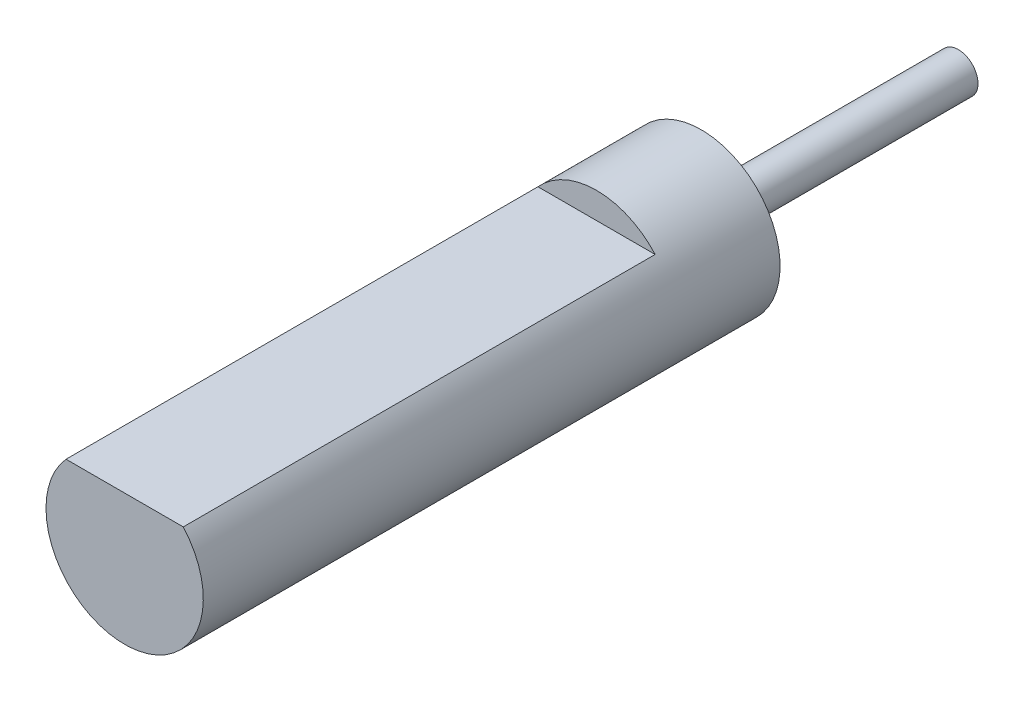
ISO-10303-21;
HEADER;
FILE_DESCRIPTION(('STEP AP214'),'2;1');
FILE_NAME('part.step','',(''),(''),'','','');
FILE_SCHEMA(('AUTOMOTIVE_DESIGN { 1 0 10303 214 1 1 1 1 }'));
ENDSEC;
DATA;
#1=APPLICATION_CONTEXT('core data for automotive mechanical design processes');
#2=APPLICATION_PROTOCOL_DEFINITION('international standard','automotive_design',2000,#1);
#3=PRODUCT_CONTEXT('',#1,'mechanical');
#4=PRODUCT('Part','Part','',(#3));
#5=PRODUCT_RELATED_PRODUCT_CATEGORY('part','',(#4));
#6=PRODUCT_DEFINITION_FORMATION('','',#4);
#7=PRODUCT_DEFINITION_CONTEXT('part definition',#1,'design');
#8=PRODUCT_DEFINITION('design','',#6,#7);
#9=PRODUCT_DEFINITION_SHAPE('','',#8);
#10=(LENGTH_UNIT() NAMED_UNIT(*) SI_UNIT(.MILLI.,.METRE.));
#11=(NAMED_UNIT(*) PLANE_ANGLE_UNIT() SI_UNIT($,.RADIAN.));
#12=(NAMED_UNIT(*) SI_UNIT($,.STERADIAN.) SOLID_ANGLE_UNIT());
#13=UNCERTAINTY_MEASURE_WITH_UNIT(LENGTH_MEASURE(1.E-05),#10,'distance_accuracy_value','');
#14=(GEOMETRIC_REPRESENTATION_CONTEXT(3) GLOBAL_UNCERTAINTY_ASSIGNED_CONTEXT((#13)) GLOBAL_UNIT_ASSIGNED_CONTEXT((#10,
#11,#12)) REPRESENTATION_CONTEXT('',''));
#15=CARTESIAN_POINT('',(0.,0.,0.));
#16=DIRECTION('',(0.,0.,1.));
#17=DIRECTION('',(1.,0.,0.));
#18=AXIS2_PLACEMENT_3D('',#15,#16,#17);
#19=CARTESIAN_POINT('',(1.83444122615383E-13,-1.99893213465373E-13,-5.7));
#20=DIRECTION('',(0.,0.,-1.));
#21=DIRECTION('',(0.,-1.,0.));
#22=AXIS2_PLACEMENT_3D('',#19,#20,#21);
#23=PLANE('',#22);
#24=CARTESIAN_POINT('',(1.83444122615383E-13,-1.99893213465373E-13,-5.7));
#25=DIRECTION('',(0.,0.,-1.));
#26=DIRECTION('',(-1.,0.,0.));
#27=AXIS2_PLACEMENT_3D('',#24,#25,#26);
#28=CIRCLE('',#27,0.375);
#29=CARTESIAN_POINT('',(0.375000000000184,-1.99985061975309E-13,-5.7));
#30=VERTEX_POINT('',#29);
#31=EDGE_CURVE('E11',#30,#30,#28,.T.);
#32=ORIENTED_EDGE('',*,*,#31,.T.);
#33=EDGE_LOOP('',(#32));
#34=FACE_BOUND('',#33,.T.);
#35=ADVANCED_FACE('F17',(#34),#23,.T.);
#36=CARTESIAN_POINT('',(1.83444122615383E-13,-1.99460272726942E-13,-2.3));
#37=DIRECTION('',(0.,0.,1.));
#38=DIRECTION('',(-1.,0.,0.));
#39=AXIS2_PLACEMENT_3D('',#36,#37,#38);
#40=CYLINDRICAL_SURFACE('',#39,0.375);
#41=CARTESIAN_POINT('',(1.83444122615383E-13,-1.99269269459987E-13,-0.8));
#42=DIRECTION('',(0.,0.,-1.));
#43=DIRECTION('',(-1.,0.,0.));
#44=AXIS2_PLACEMENT_3D('',#41,#42,#43);
#45=CIRCLE('',#44,0.375);
#46=CARTESIAN_POINT('',(0.375000000000184,-1.99269269459987E-13,-0.8));
#47=VERTEX_POINT('',#46);
#48=EDGE_CURVE('E76',#47,#47,#45,.T.);
#49=ORIENTED_EDGE('',*,*,#48,.T.);
#50=DIRECTION('',(0.,0.,-1.));
#51=VECTOR('',#50,1.);
#52=CARTESIAN_POINT('',(0.375000000000184,-1.99460272726942E-13,-2.3));
#53=LINE('',#52,#51);
#54=EDGE_CURVE('E20',#47,#30,#53,.T.);
#55=ORIENTED_EDGE('',*,*,#54,.T.);
#56=ORIENTED_EDGE('',*,*,#31,.F.);
#57=ORIENTED_EDGE('',*,*,#54,.F.);
#58=EDGE_LOOP('',(#49,#55,#56,#57));
#59=FACE_BOUND('',#58,.T.);
#60=ADVANCED_FACE('F106',(#59),#40,.T.);
#61=CARTESIAN_POINT('',(1.83444122615383E-13,-1.99014598437381E-13,1.2));
#62=DIRECTION('',(0.,0.,1.));
#63=DIRECTION('',(0.,-1.,0.));
#64=AXIS2_PLACEMENT_3D('',#61,#62,#63);
#65=PLANE('',#64);
#66=CARTESIAN_POINT('',(1.83444122615383E-13,-1.99014598437381E-13,1.2));
#67=DIRECTION('',(0.,0.,1.));
#68=DIRECTION('',(-1.,0.,0.));
#69=AXIS2_PLACEMENT_3D('',#66,#67,#68);
#70=CIRCLE('',#69,1.5);
#71=CARTESIAN_POINT('',(1.11803398876017,0.999999999996331,1.2));
#72=VERTEX_POINT('',#71);
#73=CARTESIAN_POINT('',(-1.1180339887598,0.999999999996331,1.2));
#74=VERTEX_POINT('',#73);
#75=EDGE_CURVE('E88',#72,#74,#70,.T.);
#76=ORIENTED_EDGE('',*,*,#75,.T.);
#77=DIRECTION('',(1.,0.,0.));
#78=VECTOR('',#77,1.);
#79=CARTESIAN_POINT('',(-0.599999999999816,0.999999999999801,1.2));
#80=LINE('',#79,#78);
#81=EDGE_CURVE('E97',#74,#72,#80,.T.);
#82=ORIENTED_EDGE('',*,*,#81,.T.);
#83=EDGE_LOOP('',(#76,#82));
#84=FACE_BOUND('',#83,.T.);
#85=ADVANCED_FACE('F139',(#84),#65,.T.);
#86=CARTESIAN_POINT('',(-1.19999999999982,0.999999999999801,1.2));
#87=DIRECTION('',(0.,-1.,0.));
#88=DIRECTION('',(-1.,0.,0.));
#89=AXIS2_PLACEMENT_3D('',#86,#87,#88);
#90=PLANE('',#89);
#91=DIRECTION('',(1.,0.,0.));
#92=VECTOR('',#91,1.);
#93=CARTESIAN_POINT('',(-0.599999999999816,0.999999999999802,10.2));
#94=LINE('',#93,#92);
#95=CARTESIAN_POINT('',(-1.1180339887598,0.999999999996332,10.2));
#96=VERTEX_POINT('',#95);
#97=CARTESIAN_POINT('',(1.11803398876017,0.999999999996332,10.2));
#98=VERTEX_POINT('',#97);
#99=EDGE_CURVE('E64',#96,#98,#94,.T.);
#100=ORIENTED_EDGE('',*,*,#99,.T.);
#101=DIRECTION('',(0.,0.,1.));
#102=VECTOR('',#101,1.);
#103=CARTESIAN_POINT('',(1.11803398875008,0.999999999999802,10.2));
#104=LINE('',#103,#102);
#105=EDGE_CURVE('E68',#72,#98,#104,.T.);
#106=ORIENTED_EDGE('',*,*,#105,.F.);
#107=ORIENTED_EDGE('',*,*,#81,.F.);
#108=DIRECTION('',(0.,0.,1.));
#109=VECTOR('',#108,1.);
#110=CARTESIAN_POINT('',(-1.11803398874971,0.999999999999802,10.2));
#111=LINE('',#110,#109);
#112=EDGE_CURVE('E71',#74,#96,#111,.T.);
#113=ORIENTED_EDGE('',*,*,#112,.T.);
#114=EDGE_LOOP('',(#100,#106,#107,#113));
#115=FACE_BOUND('',#114,.T.);
#116=ADVANCED_FACE('F66',(#115),#90,.F.);
#117=CARTESIAN_POINT('',(1.83444122615383E-13,-1.99269269459987E-13,-0.8));
#118=DIRECTION('',(0.,0.,1.));
#119=DIRECTION('',(0.,-1.,0.));
#120=AXIS2_PLACEMENT_3D('',#117,#118,#119);
#121=PLANE('',#120);
#122=ORIENTED_EDGE('',*,*,#48,.F.);
#123=EDGE_LOOP('',(#122));
#124=FACE_BOUND('',#123,.T.);
#125=CARTESIAN_POINT('',(1.83444122615383E-13,-1.99269269459987E-13,-0.8));
#126=DIRECTION('',(0.,0.,1.));
#127=DIRECTION('',(-1.,0.,0.));
#128=AXIS2_PLACEMENT_3D('',#125,#126,#127);
#129=CIRCLE('',#128,1.5);
#130=CARTESIAN_POINT('',(-1.49999999999982,-1.99085572440116E-13,-0.8));
#131=VERTEX_POINT('',#130);
#132=EDGE_CURVE('E114',#131,#131,#129,.T.);
#133=ORIENTED_EDGE('',*,*,#132,.F.);
#134=EDGE_LOOP('',(#133));
#135=FACE_BOUND('',#134,.T.);
#136=ADVANCED_FACE('F109',(#124,#135),#121,.F.);
#137=CARTESIAN_POINT('',(1.83444122615383E-13,-1.97868578835653E-13,10.2));
#138=DIRECTION('',(0.,0.,1.));
#139=DIRECTION('',(0.,-1.,0.));
#140=AXIS2_PLACEMENT_3D('',#137,#138,#139);
#141=PLANE('',#140);
#142=ORIENTED_EDGE('',*,*,#99,.F.);
#143=CARTESIAN_POINT('',(1.83444122615383E-13,-1.97868578835653E-13,10.2));
#144=DIRECTION('',(0.,0.,1.));
#145=DIRECTION('',(-1.,0.,0.));
#146=AXIS2_PLACEMENT_3D('',#143,#144,#145);
#147=CIRCLE('',#146,1.5);
#148=CARTESIAN_POINT('',(-1.49999999999982,-1.9750118479591E-13,10.2));
#149=VERTEX_POINT('',#148);
#150=EDGE_CURVE('E80',#96,#149,#147,.T.);
#151=ORIENTED_EDGE('',*,*,#150,.T.);
#152=CARTESIAN_POINT('',(1.83444122615383E-13,-1.97868578835653E-13,10.2));
#153=DIRECTION('',(0.,0.,1.));
#154=DIRECTION('',(-1.,0.,0.));
#155=AXIS2_PLACEMENT_3D('',#152,#153,#154);
#156=CIRCLE('',#155,1.5);
#157=EDGE_CURVE('E77',#149,#98,#156,.T.);
#158=ORIENTED_EDGE('',*,*,#157,.T.);
#159=EDGE_LOOP('',(#142,#151,#158));
#160=FACE_BOUND('',#159,.T.);
#161=ADVANCED_FACE('F79',(#160),#141,.T.);
#162=CARTESIAN_POINT('',(1.83444122615383E-13,-1.97868578835653E-13,10.2));
#163=DIRECTION('',(0.,0.,-1.));
#164=DIRECTION('',(1.,0.,0.));
#165=AXIS2_PLACEMENT_3D('',#162,#163,#164);
#166=CYLINDRICAL_SURFACE('',#165,1.5);
#167=ORIENTED_EDGE('',*,*,#132,.T.);
#168=DIRECTION('',(0.,0.,1.));
#169=VECTOR('',#168,1.);
#170=CARTESIAN_POINT('',(-1.49999999999982,-1.9750118479591E-13,10.2));
#171=LINE('',#170,#169);
#172=EDGE_CURVE('E116',#131,#149,#171,.T.);
#173=ORIENTED_EDGE('',*,*,#172,.T.);
#174=ORIENTED_EDGE('',*,*,#150,.F.);
#175=ORIENTED_EDGE('',*,*,#112,.F.);
#176=ORIENTED_EDGE('',*,*,#75,.F.);
#177=ORIENTED_EDGE('',*,*,#105,.T.);
#178=ORIENTED_EDGE('',*,*,#157,.F.);
#179=ORIENTED_EDGE('',*,*,#172,.F.);
#180=EDGE_LOOP('',(#167,#173,#174,#175,#176,#177,#178,#179));
#181=FACE_BOUND('',#180,.T.);
#182=ADVANCED_FACE('F86',(#181),#166,.T.);
#183=CLOSED_SHELL('',(#35,#60,#85,#116,#136,#161,#182));
#184=MANIFOLD_SOLID_BREP('B1',#183);
#185=ADVANCED_BREP_SHAPE_REPRESENTATION('',(#18,#184),#14);
#186=SHAPE_DEFINITION_REPRESENTATION(#9,#185);
ENDSEC;
END-ISO-10303-21;
